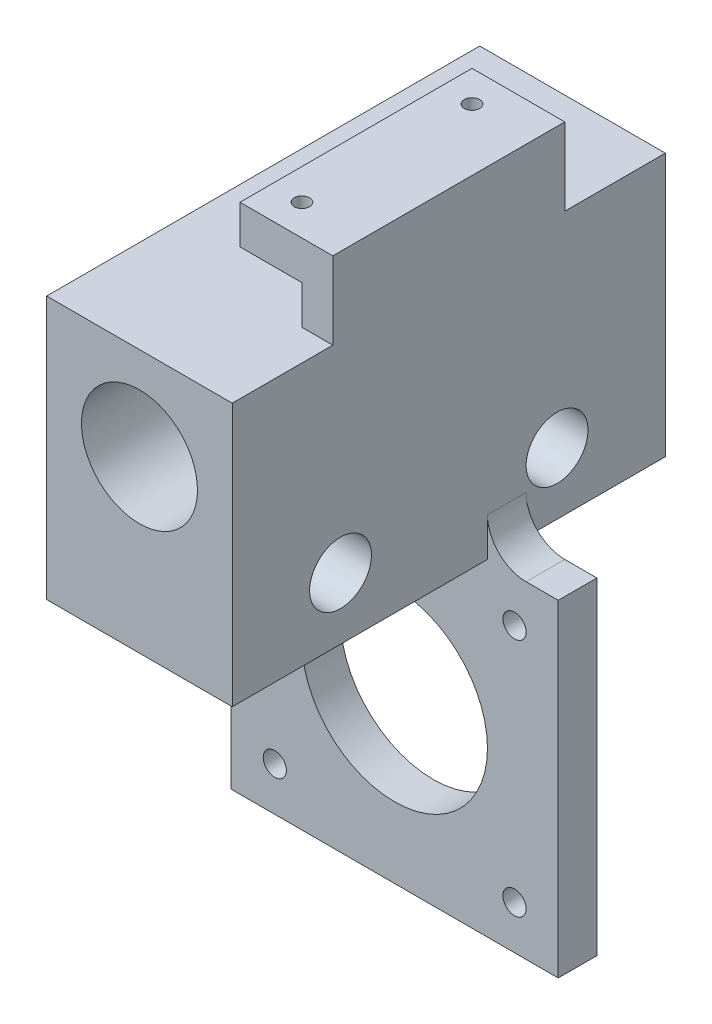
ISO-10303-21;
HEADER;
FILE_DESCRIPTION(('STEP AP214'),'2;1');
FILE_NAME('part.step','',(''),(''),'','','');
FILE_SCHEMA(('AUTOMOTIVE_DESIGN { 1 0 10303 214 1 1 1 1 }'));
ENDSEC;
DATA;
#1=APPLICATION_CONTEXT('core data for automotive mechanical design processes');
#2=APPLICATION_PROTOCOL_DEFINITION('international standard','automotive_design',2000,#1);
#3=PRODUCT_CONTEXT('',#1,'mechanical');
#4=PRODUCT('Part','Part','',(#3));
#5=PRODUCT_RELATED_PRODUCT_CATEGORY('part','',(#4));
#6=PRODUCT_DEFINITION_FORMATION('','',#4);
#7=PRODUCT_DEFINITION_CONTEXT('part definition',#1,'design');
#8=PRODUCT_DEFINITION('design','',#6,#7);
#9=PRODUCT_DEFINITION_SHAPE('','',#8);
#10=(LENGTH_UNIT() NAMED_UNIT(*) SI_UNIT(.MILLI.,.METRE.));
#11=(NAMED_UNIT(*) PLANE_ANGLE_UNIT() SI_UNIT($,.RADIAN.));
#12=(NAMED_UNIT(*) SI_UNIT($,.STERADIAN.) SOLID_ANGLE_UNIT());
#13=UNCERTAINTY_MEASURE_WITH_UNIT(LENGTH_MEASURE(1.E-05),#10,'distance_accuracy_value','');
#14=(GEOMETRIC_REPRESENTATION_CONTEXT(3) GLOBAL_UNCERTAINTY_ASSIGNED_CONTEXT((#13)) GLOBAL_UNIT_ASSIGNED_CONTEXT((#10,
#11,#12)) REPRESENTATION_CONTEXT('',''));
#15=CARTESIAN_POINT('',(0.,0.,0.));
#16=DIRECTION('',(0.,0.,1.));
#17=DIRECTION('',(1.,0.,0.));
#18=AXIS2_PLACEMENT_3D('',#15,#16,#17);
#19=CARTESIAN_POINT('',(-12.,-22.,28.));
#20=DIRECTION('',(0.,1.,0.));
#21=DIRECTION('',(0.,0.,1.));
#22=AXIS2_PLACEMENT_3D('',#19,#20,#21);
#23=PLANE('',#22);
#24=DIRECTION('',(-1.,0.,0.));
#25=VECTOR('',#24,1.);
#26=CARTESIAN_POINT('',(-21.15,-22.,-5.));
#27=LINE('',#26,#25);
#28=CARTESIAN_POINT('',(12.,-22.,-5.));
#29=VERTEX_POINT('',#28);
#30=CARTESIAN_POINT('',(-12.,-22.,-5.));
#31=VERTEX_POINT('',#30);
#32=EDGE_CURVE('E330',#29,#31,#27,.T.);
#33=ORIENTED_EDGE('',*,*,#32,.F.);
#34=DIRECTION('',(0.,0.,-1.));
#35=VECTOR('',#34,1.);
#36=CARTESIAN_POINT('',(12.,-22.,28.));
#37=LINE('',#36,#35);
#38=CARTESIAN_POINT('',(12.,-22.,28.));
#39=VERTEX_POINT('',#38);
#40=EDGE_CURVE('E296',#39,#29,#37,.T.);
#41=ORIENTED_EDGE('',*,*,#40,.F.);
#42=DIRECTION('',(1.,0.,0.));
#43=VECTOR('',#42,1.);
#44=CARTESIAN_POINT('',(-12.,-22.,28.));
#45=LINE('',#44,#43);
#46=CARTESIAN_POINT('',(-12.,-22.,28.));
#47=VERTEX_POINT('',#46);
#48=EDGE_CURVE('E272',#47,#39,#45,.T.);
#49=ORIENTED_EDGE('',*,*,#48,.F.);
#50=DIRECTION('',(0.,0.,-1.));
#51=VECTOR('',#50,1.);
#52=CARTESIAN_POINT('',(-12.,-22.,28.));
#53=LINE('',#52,#51);
#54=EDGE_CURVE('E299',#47,#31,#53,.T.);
#55=ORIENTED_EDGE('',*,*,#54,.T.);
#56=EDGE_LOOP('',(#33,#41,#49,#55));
#57=FACE_BOUND('',#56,.T.);
#58=ADVANCED_FACE('F34',(#57),#23,.F.);
#59=DIRECTION('',(1.,0.,0.));
#60=VECTOR('',#59,1.);
#61=CARTESIAN_POINT('',(-21.15,-22.,-10.));
#62=LINE('',#61,#60);
#63=CARTESIAN_POINT('',(-12.,-22.,-10.));
#64=VERTEX_POINT('',#63);
#65=CARTESIAN_POINT('',(12.,-22.,-10.));
#66=VERTEX_POINT('',#65);
#67=EDGE_CURVE('E308',#64,#66,#62,.T.);
#68=ORIENTED_EDGE('',*,*,#67,.F.);
#69=CARTESIAN_POINT('',(-12.,-22.,-28.));
#70=VERTEX_POINT('',#69);
#71=EDGE_CURVE('E298',#64,#70,#53,.T.);
#72=ORIENTED_EDGE('',*,*,#71,.T.);
#73=DIRECTION('',(1.,0.,0.));
#74=VECTOR('',#73,1.);
#75=CARTESIAN_POINT('',(-12.,-22.,-28.));
#76=LINE('',#75,#74);
#77=CARTESIAN_POINT('',(12.,-22.,-28.));
#78=VERTEX_POINT('',#77);
#79=EDGE_CURVE('E282',#70,#78,#76,.T.);
#80=ORIENTED_EDGE('',*,*,#79,.T.);
#81=EDGE_CURVE('E295',#66,#78,#37,.T.);
#82=ORIENTED_EDGE('',*,*,#81,.F.);
#83=EDGE_LOOP('',(#68,#72,#80,#82));
#84=FACE_BOUND('',#83,.T.);
#85=ADVANCED_FACE('F434',(#84),#23,.F.);
#86=CARTESIAN_POINT('',(-12.,12.,28.));
#87=DIRECTION('',(0.,-1.,0.));
#88=DIRECTION('',(0.,0.,-1.));
#89=AXIS2_PLACEMENT_3D('',#86,#87,#88);
#90=PLANE('',#89);
#91=DIRECTION('',(-1.,0.,0.));
#92=VECTOR('',#91,1.);
#93=CARTESIAN_POINT('',(-12.,12.,-28.));
#94=LINE('',#93,#92);
#95=CARTESIAN_POINT('',(12.,12.,-28.));
#96=VERTEX_POINT('',#95);
#97=CARTESIAN_POINT('',(-12.,12.,-28.));
#98=VERTEX_POINT('',#97);
#99=EDGE_CURVE('E273',#96,#98,#94,.T.);
#100=ORIENTED_EDGE('',*,*,#99,.T.);
#101=DIRECTION('',(0.,0.,-1.));
#102=VECTOR('',#101,1.);
#103=CARTESIAN_POINT('',(-12.,12.,28.));
#104=LINE('',#103,#102);
#105=CARTESIAN_POINT('',(-12.,12.,28.));
#106=VERTEX_POINT('',#105);
#107=EDGE_CURVE('E279',#106,#98,#104,.T.);
#108=ORIENTED_EDGE('',*,*,#107,.F.);
#109=DIRECTION('',(-1.,0.,0.));
#110=VECTOR('',#109,1.);
#111=CARTESIAN_POINT('',(-12.,12.,28.));
#112=LINE('',#111,#110);
#113=CARTESIAN_POINT('',(12.,12.,28.));
#114=VERTEX_POINT('',#113);
#115=EDGE_CURVE('E277',#114,#106,#112,.T.);
#116=ORIENTED_EDGE('',*,*,#115,.F.);
#117=DIRECTION('',(0.,0.,-1.));
#118=VECTOR('',#117,1.);
#119=CARTESIAN_POINT('',(12.,12.,28.));
#120=LINE('',#119,#118);
#121=CARTESIAN_POINT('',(12.,12.,15.));
#122=VERTEX_POINT('',#121);
#123=EDGE_CURVE('E292',#114,#122,#120,.T.);
#124=ORIENTED_EDGE('',*,*,#123,.T.);
#125=DIRECTION('',(1.,0.,0.));
#126=VECTOR('',#125,1.);
#127=CARTESIAN_POINT('',(0.,12.,15.));
#128=LINE('',#127,#126);
#129=CARTESIAN_POINT('',(8.,12.,15.));
#130=VERTEX_POINT('',#129);
#131=EDGE_CURVE('E233',#130,#122,#128,.T.);
#132=ORIENTED_EDGE('',*,*,#131,.F.);
#133=DIRECTION('',(0.,0.,1.));
#134=VECTOR('',#133,1.);
#135=CARTESIAN_POINT('',(8.,12.,-28.));
#136=LINE('',#135,#134);
#137=CARTESIAN_POINT('',(8.,12.,-15.));
#138=VERTEX_POINT('',#137);
#139=EDGE_CURVE('E229',#138,#130,#136,.T.);
#140=ORIENTED_EDGE('',*,*,#139,.F.);
#141=DIRECTION('',(-1.,0.,0.));
#142=VECTOR('',#141,1.);
#143=CARTESIAN_POINT('',(0.,12.,-15.));
#144=LINE('',#143,#142);
#145=CARTESIAN_POINT('',(12.,12.,-15.));
#146=VERTEX_POINT('',#145);
#147=EDGE_CURVE('E241',#146,#138,#144,.T.);
#148=ORIENTED_EDGE('',*,*,#147,.F.);
#149=EDGE_CURVE('E291',#146,#96,#120,.T.);
#150=ORIENTED_EDGE('',*,*,#149,.T.);
#151=EDGE_LOOP('',(#100,#108,#116,#124,#132,#140,#148,#150));
#152=FACE_BOUND('',#151,.T.);
#153=ADVANCED_FACE('F439',(#152),#90,.F.);
#154=CARTESIAN_POINT('',(0.,0.,28.));
#155=DIRECTION('',(0.,0.,1.));
#156=DIRECTION('',(1.,0.,0.));
#157=AXIS2_PLACEMENT_3D('',#154,#155,#156);
#158=PLANE('',#157);
#159=DIRECTION('',(0.,-1.,0.));
#160=VECTOR('',#159,1.);
#161=CARTESIAN_POINT('',(-12.,12.,28.));
#162=LINE('',#161,#160);
#163=EDGE_CURVE('E269',#106,#47,#162,.T.);
#164=ORIENTED_EDGE('',*,*,#163,.T.);
#165=ORIENTED_EDGE('',*,*,#48,.T.);
#166=DIRECTION('',(0.,1.,0.));
#167=VECTOR('',#166,1.);
#168=CARTESIAN_POINT('',(12.,12.,28.));
#169=LINE('',#168,#167);
#170=EDGE_CURVE('E275',#39,#114,#169,.T.);
#171=ORIENTED_EDGE('',*,*,#170,.T.);
#172=ORIENTED_EDGE('',*,*,#115,.T.);
#173=EDGE_LOOP('',(#164,#165,#171,#172));
#174=FACE_BOUND('',#173,.T.);
#175=CARTESIAN_POINT('',(0.,0.,28.));
#176=DIRECTION('',(0.,0.,1.));
#177=DIRECTION('',(1.,0.,0.));
#178=AXIS2_PLACEMENT_3D('',#175,#176,#177);
#179=CIRCLE('',#178,7.5);
#180=CARTESIAN_POINT('',(7.5,0.,28.));
#181=VERTEX_POINT('',#180);
#182=EDGE_CURVE('E263',#181,#181,#179,.T.);
#183=ORIENTED_EDGE('',*,*,#182,.F.);
#184=EDGE_LOOP('',(#183));
#185=FACE_BOUND('',#184,.T.);
#186=ADVANCED_FACE('F477',(#174,#185),#158,.T.);
#187=CARTESIAN_POINT('',(0.,0.,-28.));
#188=DIRECTION('',(0.,0.,1.));
#189=DIRECTION('',(1.,0.,0.));
#190=AXIS2_PLACEMENT_3D('',#187,#188,#189);
#191=PLANE('',#190);
#192=DIRECTION('',(0.,-1.,0.));
#193=VECTOR('',#192,1.);
#194=CARTESIAN_POINT('',(-12.,12.,-28.));
#195=LINE('',#194,#193);
#196=EDGE_CURVE('E266',#98,#70,#195,.T.);
#197=ORIENTED_EDGE('',*,*,#196,.F.);
#198=ORIENTED_EDGE('',*,*,#99,.F.);
#199=DIRECTION('',(0.,1.,0.));
#200=VECTOR('',#199,1.);
#201=CARTESIAN_POINT('',(12.,12.,-28.));
#202=LINE('',#201,#200);
#203=EDGE_CURVE('E285',#78,#96,#202,.T.);
#204=ORIENTED_EDGE('',*,*,#203,.F.);
#205=ORIENTED_EDGE('',*,*,#79,.F.);
#206=EDGE_LOOP('',(#197,#198,#204,#205));
#207=FACE_BOUND('',#206,.T.);
#208=CARTESIAN_POINT('',(0.,0.,-28.));
#209=DIRECTION('',(0.,0.,1.));
#210=DIRECTION('',(1.,0.,0.));
#211=AXIS2_PLACEMENT_3D('',#208,#209,#210);
#212=CIRCLE('',#211,7.5);
#213=CARTESIAN_POINT('',(7.5,0.,-28.));
#214=VERTEX_POINT('',#213);
#215=EDGE_CURVE('E262',#214,#214,#212,.T.);
#216=ORIENTED_EDGE('',*,*,#215,.T.);
#217=EDGE_LOOP('',(#216));
#218=FACE_BOUND('',#217,.T.);
#219=ADVANCED_FACE('F446',(#207,#218),#191,.F.);
#220=CARTESIAN_POINT('',(-12.,12.,28.));
#221=DIRECTION('',(1.,0.,0.));
#222=DIRECTION('',(0.,1.,0.));
#223=AXIS2_PLACEMENT_3D('',#220,#221,#222);
#224=PLANE('',#223);
#225=ORIENTED_EDGE('',*,*,#71,.F.);
#226=DIRECTION('',(0.,1.,0.));
#227=VECTOR('',#226,1.);
#228=CARTESIAN_POINT('',(-12.,-64.3,-10.));
#229=LINE('',#228,#227);
#230=CARTESIAN_POINT('',(-12.,-17.,-10.));
#231=VERTEX_POINT('',#230);
#232=EDGE_CURVE('E335',#64,#231,#229,.T.);
#233=ORIENTED_EDGE('',*,*,#232,.T.);
#234=DIRECTION('',(0.,0.,-1.));
#235=VECTOR('',#234,1.);
#236=CARTESIAN_POINT('',(-12.,-17.,-5.));
#237=LINE('',#236,#235);
#238=CARTESIAN_POINT('',(-12.,-17.,-5.));
#239=VERTEX_POINT('',#238);
#240=EDGE_CURVE('E332',#231,#239,#237,.F.);
#241=ORIENTED_EDGE('',*,*,#240,.T.);
#242=DIRECTION('',(0.,-1.,0.));
#243=VECTOR('',#242,1.);
#244=CARTESIAN_POINT('',(-12.,-64.3,-5.));
#245=LINE('',#244,#243);
#246=EDGE_CURVE('E329',#239,#31,#245,.T.);
#247=ORIENTED_EDGE('',*,*,#246,.T.);
#248=ORIENTED_EDGE('',*,*,#54,.F.);
#249=ORIENTED_EDGE('',*,*,#163,.F.);
#250=ORIENTED_EDGE('',*,*,#107,.T.);
#251=ORIENTED_EDGE('',*,*,#196,.T.);
#252=EDGE_LOOP('',(#225,#233,#241,#247,#248,#249,#250,#251));
#253=FACE_BOUND('',#252,.T.);
#254=ADVANCED_FACE('F444',(#253),#224,.F.);
#255=CARTESIAN_POINT('',(12.,12.,28.));
#256=DIRECTION('',(-1.,0.,0.));
#257=DIRECTION('',(0.,-1.,0.));
#258=AXIS2_PLACEMENT_3D('',#255,#256,#257);
#259=PLANE('',#258);
#260=CARTESIAN_POINT('',(12.,-14.,-14.));
#261=DIRECTION('',(1.,0.,0.));
#262=DIRECTION('',(0.,1.,0.));
#263=AXIS2_PLACEMENT_3D('',#260,#261,#262);
#264=CIRCLE('',#263,4.);
#265=CARTESIAN_POINT('',(12.,-10.,-14.));
#266=VERTEX_POINT('',#265);
#267=EDGE_CURVE('E195',#266,#266,#264,.T.);
#268=ORIENTED_EDGE('',*,*,#267,.F.);
#269=EDGE_LOOP('',(#268));
#270=FACE_BOUND('',#269,.T.);
#271=CARTESIAN_POINT('',(12.,-14.,14.));
#272=DIRECTION('',(1.,0.,0.));
#273=DIRECTION('',(0.,1.,0.));
#274=AXIS2_PLACEMENT_3D('',#271,#272,#273);
#275=CIRCLE('',#274,4.);
#276=CARTESIAN_POINT('',(12.,-10.,14.));
#277=VERTEX_POINT('',#276);
#278=EDGE_CURVE('E205',#277,#277,#275,.T.);
#279=ORIENTED_EDGE('',*,*,#278,.F.);
#280=EDGE_LOOP('',(#279));
#281=FACE_BOUND('',#280,.T.);
#282=DIRECTION('',(0.,0.,-1.));
#283=VECTOR('',#282,1.);
#284=CARTESIAN_POINT('',(12.,-17.,-10.));
#285=LINE('',#284,#283);
#286=CARTESIAN_POINT('',(12.,-17.,-5.));
#287=VERTEX_POINT('',#286);
#288=CARTESIAN_POINT('',(12.,-17.,-10.));
#289=VERTEX_POINT('',#288);
#290=EDGE_CURVE('E343',#287,#289,#285,.T.);
#291=ORIENTED_EDGE('',*,*,#290,.T.);
#292=DIRECTION('',(0.,-1.,0.));
#293=VECTOR('',#292,1.);
#294=CARTESIAN_POINT('',(12.,-64.3,-10.));
#295=LINE('',#294,#293);
#296=EDGE_CURVE('E346',#289,#66,#295,.T.);
#297=ORIENTED_EDGE('',*,*,#296,.T.);
#298=ORIENTED_EDGE('',*,*,#81,.T.);
#299=ORIENTED_EDGE('',*,*,#203,.T.);
#300=ORIENTED_EDGE('',*,*,#149,.F.);
#301=DIRECTION('',(0.,-1.,0.));
#302=VECTOR('',#301,1.);
#303=CARTESIAN_POINT('',(12.,22.,-15.));
#304=LINE('',#303,#302);
#305=CARTESIAN_POINT('',(12.,22.,-15.));
#306=VERTEX_POINT('',#305);
#307=EDGE_CURVE('E253',#306,#146,#304,.T.);
#308=ORIENTED_EDGE('',*,*,#307,.F.);
#309=DIRECTION('',(0.,0.,-1.));
#310=VECTOR('',#309,1.);
#311=CARTESIAN_POINT('',(12.,22.,-15.));
#312=LINE('',#311,#310);
#313=CARTESIAN_POINT('',(12.,22.,15.));
#314=VERTEX_POINT('',#313);
#315=EDGE_CURVE('E243',#314,#306,#312,.T.);
#316=ORIENTED_EDGE('',*,*,#315,.F.);
#317=DIRECTION('',(0.,-1.,0.));
#318=VECTOR('',#317,1.);
#319=CARTESIAN_POINT('',(12.,22.,15.));
#320=LINE('',#319,#318);
#321=EDGE_CURVE('E256',#314,#122,#320,.T.);
#322=ORIENTED_EDGE('',*,*,#321,.T.);
#323=ORIENTED_EDGE('',*,*,#123,.F.);
#324=ORIENTED_EDGE('',*,*,#170,.F.);
#325=ORIENTED_EDGE('',*,*,#40,.T.);
#326=DIRECTION('',(0.,1.,0.));
#327=VECTOR('',#326,1.);
#328=CARTESIAN_POINT('',(12.,-64.3,-5.));
#329=LINE('',#328,#327);
#330=EDGE_CURVE('E48',#29,#287,#329,.T.);
#331=ORIENTED_EDGE('',*,*,#330,.T.);
#332=EDGE_LOOP('',(#291,#297,#298,#299,#300,#308,#316,#322,#323,#324,#325,#331));
#333=FACE_BOUND('',#332,.T.);
#334=ADVANCED_FACE('F365',(#270,#281,#333),#259,.F.);
#335=CARTESIAN_POINT('',(0.,0.,28.));
#336=DIRECTION('',(0.,0.,-1.));
#337=DIRECTION('',(-1.,0.,0.));
#338=AXIS2_PLACEMENT_3D('',#335,#336,#337);
#339=CYLINDRICAL_SURFACE('',#338,7.5);
#340=ORIENTED_EDGE('',*,*,#182,.T.);
#341=EDGE_LOOP('',(#340));
#342=FACE_BOUND('',#341,.T.);
#343=ORIENTED_EDGE('',*,*,#215,.F.);
#344=EDGE_LOOP('',(#343));
#345=FACE_BOUND('',#344,.T.);
#346=ADVANCED_FACE('F524',(#342,#345),#339,.F.);
#347=CARTESIAN_POINT('',(0.,22.,-15.));
#348=DIRECTION('',(1.,0.,0.));
#349=DIRECTION('',(0.,0.,-1.));
#350=AXIS2_PLACEMENT_3D('',#347,#348,#349);
#351=PLANE('',#350);
#352=DIRECTION('',(0.,-1.,0.));
#353=VECTOR('',#352,1.);
#354=CARTESIAN_POINT('',(0.,22.,-15.));
#355=LINE('',#354,#353);
#356=CARTESIAN_POINT('',(0.,22.,-15.));
#357=VERTEX_POINT('',#356);
#358=CARTESIAN_POINT('',(0.,17.,-15.));
#359=VERTEX_POINT('',#358);
#360=EDGE_CURVE('E247',#357,#359,#355,.T.);
#361=ORIENTED_EDGE('',*,*,#360,.T.);
#362=DIRECTION('',(0.,0.,1.));
#363=VECTOR('',#362,1.);
#364=CARTESIAN_POINT('',(0.,17.,-28.));
#365=LINE('',#364,#363);
#366=CARTESIAN_POINT('',(0.,17.,15.));
#367=VERTEX_POINT('',#366);
#368=EDGE_CURVE('E230',#359,#367,#365,.T.);
#369=ORIENTED_EDGE('',*,*,#368,.T.);
#370=DIRECTION('',(0.,-1.,0.));
#371=VECTOR('',#370,1.);
#372=CARTESIAN_POINT('',(0.,22.,15.));
#373=LINE('',#372,#371);
#374=CARTESIAN_POINT('',(0.,22.,15.));
#375=VERTEX_POINT('',#374);
#376=EDGE_CURVE('E259',#375,#367,#373,.T.);
#377=ORIENTED_EDGE('',*,*,#376,.F.);
#378=DIRECTION('',(0.,0.,1.));
#379=VECTOR('',#378,1.);
#380=CARTESIAN_POINT('',(0.,22.,-15.));
#381=LINE('',#380,#379);
#382=EDGE_CURVE('E237',#357,#375,#381,.T.);
#383=ORIENTED_EDGE('',*,*,#382,.F.);
#384=EDGE_LOOP('',(#361,#369,#377,#383));
#385=FACE_BOUND('',#384,.T.);
#386=ADVANCED_FACE('F499',(#385),#351,.F.);
#387=CARTESIAN_POINT('',(0.,22.,15.));
#388=DIRECTION('',(0.,0.,-1.));
#389=DIRECTION('',(-1.,0.,0.));
#390=AXIS2_PLACEMENT_3D('',#387,#388,#389);
#391=PLANE('',#390);
#392=ORIENTED_EDGE('',*,*,#376,.T.);
#393=DIRECTION('',(-1.,0.,0.));
#394=VECTOR('',#393,1.);
#395=CARTESIAN_POINT('',(0.,17.,15.));
#396=LINE('',#395,#394);
#397=CARTESIAN_POINT('',(8.,17.,15.));
#398=VERTEX_POINT('',#397);
#399=EDGE_CURVE('E227',#398,#367,#396,.T.);
#400=ORIENTED_EDGE('',*,*,#399,.F.);
#401=DIRECTION('',(0.,1.,0.));
#402=VECTOR('',#401,1.);
#403=CARTESIAN_POINT('',(8.,17.,15.));
#404=LINE('',#403,#402);
#405=EDGE_CURVE('E224',#130,#398,#404,.T.);
#406=ORIENTED_EDGE('',*,*,#405,.F.);
#407=ORIENTED_EDGE('',*,*,#131,.T.);
#408=ORIENTED_EDGE('',*,*,#321,.F.);
#409=DIRECTION('',(1.,0.,0.));
#410=VECTOR('',#409,1.);
#411=CARTESIAN_POINT('',(0.,22.,15.));
#412=LINE('',#411,#410);
#413=EDGE_CURVE('E240',#375,#314,#412,.T.);
#414=ORIENTED_EDGE('',*,*,#413,.F.);
#415=EDGE_LOOP('',(#392,#400,#406,#407,#408,#414));
#416=FACE_BOUND('',#415,.T.);
#417=ADVANCED_FACE('F483',(#416),#391,.F.);
#418=CARTESIAN_POINT('',(0.,22.,-15.));
#419=DIRECTION('',(0.,0.,1.));
#420=DIRECTION('',(1.,0.,0.));
#421=AXIS2_PLACEMENT_3D('',#418,#419,#420);
#422=PLANE('',#421);
#423=DIRECTION('',(0.,1.,0.));
#424=VECTOR('',#423,1.);
#425=CARTESIAN_POINT('',(8.,22.,-15.));
#426=LINE('',#425,#424);
#427=CARTESIAN_POINT('',(8.,17.,-15.));
#428=VERTEX_POINT('',#427);
#429=EDGE_CURVE('E302',#138,#428,#426,.T.);
#430=ORIENTED_EDGE('',*,*,#429,.T.);
#431=DIRECTION('',(-1.,0.,0.));
#432=VECTOR('',#431,1.);
#433=CARTESIAN_POINT('',(0.,17.,-15.));
#434=LINE('',#433,#432);
#435=EDGE_CURVE('E305',#428,#359,#434,.T.);
#436=ORIENTED_EDGE('',*,*,#435,.T.);
#437=ORIENTED_EDGE('',*,*,#360,.F.);
#438=DIRECTION('',(-1.,0.,0.));
#439=VECTOR('',#438,1.);
#440=CARTESIAN_POINT('',(0.,22.,-15.));
#441=LINE('',#440,#439);
#442=EDGE_CURVE('E245',#306,#357,#441,.T.);
#443=ORIENTED_EDGE('',*,*,#442,.F.);
#444=ORIENTED_EDGE('',*,*,#307,.T.);
#445=ORIENTED_EDGE('',*,*,#147,.T.);
#446=EDGE_LOOP('',(#430,#436,#437,#443,#444,#445));
#447=FACE_BOUND('',#446,.T.);
#448=ADVANCED_FACE('F491',(#447),#422,.F.);
#449=CARTESIAN_POINT('',(0.,22.,0.));
#450=DIRECTION('',(0.,1.,0.));
#451=DIRECTION('',(0.,0.,1.));
#452=AXIS2_PLACEMENT_3D('',#449,#450,#451);
#453=PLANE('',#452);
#454=CARTESIAN_POINT('',(4.,22.,11.));
#455=DIRECTION('',(0.,1.,0.));
#456=DIRECTION('',(0.,0.,1.));
#457=AXIS2_PLACEMENT_3D('',#454,#455,#456);
#458=CIRCLE('',#457,1.);
#459=CARTESIAN_POINT('',(4.,22.,12.));
#460=VERTEX_POINT('',#459);
#461=EDGE_CURVE('E215',#460,#460,#458,.T.);
#462=ORIENTED_EDGE('',*,*,#461,.F.);
#463=EDGE_LOOP('',(#462));
#464=FACE_BOUND('',#463,.T.);
#465=CARTESIAN_POINT('',(4.,22.,-11.));
#466=DIRECTION('',(0.,1.,0.));
#467=DIRECTION('',(0.,0.,1.));
#468=AXIS2_PLACEMENT_3D('',#465,#466,#467);
#469=CIRCLE('',#468,1.);
#470=CARTESIAN_POINT('',(4.,22.,-10.));
#471=VERTEX_POINT('',#470);
#472=EDGE_CURVE('E221',#471,#471,#469,.T.);
#473=ORIENTED_EDGE('',*,*,#472,.F.);
#474=EDGE_LOOP('',(#473));
#475=FACE_BOUND('',#474,.T.);
#476=ORIENTED_EDGE('',*,*,#382,.T.);
#477=ORIENTED_EDGE('',*,*,#413,.T.);
#478=ORIENTED_EDGE('',*,*,#315,.T.);
#479=ORIENTED_EDGE('',*,*,#442,.T.);
#480=EDGE_LOOP('',(#476,#477,#478,#479));
#481=FACE_BOUND('',#480,.T.);
#482=ADVANCED_FACE('F496',(#464,#475,#481),#453,.T.);
#483=CARTESIAN_POINT('',(0.,17.,-28.));
#484=DIRECTION('',(0.,1.,0.));
#485=DIRECTION('',(0.,0.,1.));
#486=AXIS2_PLACEMENT_3D('',#483,#484,#485);
#487=PLANE('',#486);
#488=CARTESIAN_POINT('',(4.,17.,11.));
#489=DIRECTION('',(0.,1.,0.));
#490=DIRECTION('',(0.,0.,1.));
#491=AXIS2_PLACEMENT_3D('',#488,#489,#490);
#492=CIRCLE('',#491,1.);
#493=CARTESIAN_POINT('',(4.,17.,12.));
#494=VERTEX_POINT('',#493);
#495=EDGE_CURVE('E210',#494,#494,#492,.F.);
#496=ORIENTED_EDGE('',*,*,#495,.F.);
#497=EDGE_LOOP('',(#496));
#498=FACE_BOUND('',#497,.T.);
#499=CARTESIAN_POINT('',(4.,17.,-11.));
#500=DIRECTION('',(0.,1.,0.));
#501=DIRECTION('',(0.,0.,1.));
#502=AXIS2_PLACEMENT_3D('',#499,#500,#501);
#503=CIRCLE('',#502,1.);
#504=CARTESIAN_POINT('',(4.,17.,-10.));
#505=VERTEX_POINT('',#504);
#506=EDGE_CURVE('E218',#505,#505,#503,.F.);
#507=ORIENTED_EDGE('',*,*,#506,.F.);
#508=EDGE_LOOP('',(#507));
#509=FACE_BOUND('',#508,.T.);
#510=DIRECTION('',(0.,0.,1.));
#511=VECTOR('',#510,1.);
#512=CARTESIAN_POINT('',(8.,17.,-28.));
#513=LINE('',#512,#511);
#514=EDGE_CURVE('E234',#428,#398,#513,.T.);
#515=ORIENTED_EDGE('',*,*,#514,.T.);
#516=ORIENTED_EDGE('',*,*,#399,.T.);
#517=ORIENTED_EDGE('',*,*,#368,.F.);
#518=ORIENTED_EDGE('',*,*,#435,.F.);
#519=EDGE_LOOP('',(#515,#516,#517,#518));
#520=FACE_BOUND('',#519,.T.);
#521=ADVANCED_FACE('F501',(#498,#509,#520),#487,.F.);
#522=CARTESIAN_POINT('',(8.,17.,-28.));
#523=DIRECTION('',(1.,0.,0.));
#524=DIRECTION('',(0.,0.,-1.));
#525=AXIS2_PLACEMENT_3D('',#522,#523,#524);
#526=PLANE('',#525);
#527=ORIENTED_EDGE('',*,*,#139,.T.);
#528=ORIENTED_EDGE('',*,*,#405,.T.);
#529=ORIENTED_EDGE('',*,*,#514,.F.);
#530=ORIENTED_EDGE('',*,*,#429,.F.);
#531=EDGE_LOOP('',(#527,#528,#529,#530));
#532=FACE_BOUND('',#531,.T.);
#533=ADVANCED_FACE('F488',(#532),#526,.F.);
#534=CARTESIAN_POINT('',(4.,-22.001,-11.));
#535=DIRECTION('',(0.,1.,0.));
#536=DIRECTION('',(0.,0.,1.));
#537=AXIS2_PLACEMENT_3D('',#534,#535,#536);
#538=CYLINDRICAL_SURFACE('',#537,1.);
#539=ORIENTED_EDGE('',*,*,#472,.T.);
#540=EDGE_LOOP('',(#539));
#541=FACE_BOUND('',#540,.T.);
#542=ORIENTED_EDGE('',*,*,#506,.T.);
#543=EDGE_LOOP('',(#542));
#544=FACE_BOUND('',#543,.T.);
#545=ADVANCED_FACE('F509',(#541,#544),#538,.F.);
#546=CARTESIAN_POINT('',(4.,-22.001,11.));
#547=DIRECTION('',(0.,1.,0.));
#548=DIRECTION('',(0.,0.,1.));
#549=AXIS2_PLACEMENT_3D('',#546,#547,#548);
#550=CYLINDRICAL_SURFACE('',#549,1.);
#551=ORIENTED_EDGE('',*,*,#461,.T.);
#552=EDGE_LOOP('',(#551));
#553=FACE_BOUND('',#552,.T.);
#554=ORIENTED_EDGE('',*,*,#495,.T.);
#555=EDGE_LOOP('',(#554));
#556=FACE_BOUND('',#555,.T.);
#557=ADVANCED_FACE('F593',(#553,#556),#550,.F.);
#558=CARTESIAN_POINT('',(-8.,-14.,14.));
#559=DIRECTION('',(1.,0.,0.));
#560=DIRECTION('',(0.,1.,0.));
#561=AXIS2_PLACEMENT_3D('',#558,#559,#560);
#562=CYLINDRICAL_SURFACE('',#561,4.);
#563=CARTESIAN_POINT('',(-8.,-14.,14.));
#564=DIRECTION('',(1.,0.,0.));
#565=DIRECTION('',(0.,1.,0.));
#566=AXIS2_PLACEMENT_3D('',#563,#564,#565);
#567=CIRCLE('',#566,4.);
#568=CARTESIAN_POINT('',(-8.,-10.,14.));
#569=VERTEX_POINT('',#568);
#570=EDGE_CURVE('E207',#569,#569,#567,.T.);
#571=ORIENTED_EDGE('',*,*,#570,.F.);
#572=EDGE_LOOP('',(#571));
#573=FACE_BOUND('',#572,.T.);
#574=ORIENTED_EDGE('',*,*,#278,.T.);
#575=EDGE_LOOP('',(#574));
#576=FACE_BOUND('',#575,.T.);
#577=ADVANCED_FACE('F602',(#573,#576),#562,.F.);
#578=CARTESIAN_POINT('',(-8.,-14.,14.));
#579=DIRECTION('',(1.,0.,0.));
#580=DIRECTION('',(0.,1.,0.));
#581=AXIS2_PLACEMENT_3D('',#578,#579,#580);
#582=PLANE('',#581);
#583=ORIENTED_EDGE('',*,*,#570,.T.);
#584=EDGE_LOOP('',(#583));
#585=FACE_BOUND('',#584,.T.);
#586=ADVANCED_FACE('F611',(#585),#582,.T.);
#587=CARTESIAN_POINT('',(-8.,-14.,-14.));
#588=DIRECTION('',(1.,0.,0.));
#589=DIRECTION('',(0.,1.,0.));
#590=AXIS2_PLACEMENT_3D('',#587,#588,#589);
#591=CYLINDRICAL_SURFACE('',#590,4.);
#592=CARTESIAN_POINT('',(-8.,-14.,-14.));
#593=DIRECTION('',(1.,0.,0.));
#594=DIRECTION('',(0.,1.,0.));
#595=AXIS2_PLACEMENT_3D('',#592,#593,#594);
#596=CIRCLE('',#595,4.);
#597=CARTESIAN_POINT('',(-8.,-10.,-14.));
#598=VERTEX_POINT('',#597);
#599=EDGE_CURVE('E198',#598,#598,#596,.T.);
#600=ORIENTED_EDGE('',*,*,#599,.F.);
#601=EDGE_LOOP('',(#600));
#602=FACE_BOUND('',#601,.T.);
#603=ORIENTED_EDGE('',*,*,#267,.T.);
#604=EDGE_LOOP('',(#603));
#605=FACE_BOUND('',#604,.T.);
#606=ADVANCED_FACE('F621',(#602,#605),#591,.F.);
#607=CARTESIAN_POINT('',(-8.,-14.,-14.));
#608=DIRECTION('',(1.,0.,0.));
#609=DIRECTION('',(0.,1.,0.));
#610=AXIS2_PLACEMENT_3D('',#607,#608,#609);
#611=PLANE('',#610);
#612=ORIENTED_EDGE('',*,*,#599,.T.);
#613=EDGE_LOOP('',(#612));
#614=FACE_BOUND('',#613,.T.);
#615=ADVANCED_FACE('F631',(#614),#611,.T.);
#616=CARTESIAN_POINT('',(0.,-22.,0.));
#617=DIRECTION('',(0.,-1.,0.));
#618=DIRECTION('',(0.,0.,-1.));
#619=AXIS2_PLACEMENT_3D('',#616,#617,#618);
#620=PLANE('',#619);
#621=CARTESIAN_POINT('',(-17.,-22.,-5.));
#622=VERTEX_POINT('',#621);
#623=CARTESIAN_POINT('',(-21.15,-22.,-5.));
#624=VERTEX_POINT('',#623);
#625=EDGE_CURVE('E361',#622,#624,#27,.T.);
#626=ORIENTED_EDGE('',*,*,#625,.F.);
#627=DIRECTION('',(0.,0.,-1.));
#628=VECTOR('',#627,1.);
#629=CARTESIAN_POINT('',(-17.,-22.,-10.));
#630=LINE('',#629,#628);
#631=CARTESIAN_POINT('',(-17.,-22.,-10.));
#632=VERTEX_POINT('',#631);
#633=EDGE_CURVE('E326',#622,#632,#630,.T.);
#634=ORIENTED_EDGE('',*,*,#633,.T.);
#635=CARTESIAN_POINT('',(-21.15,-22.,-10.));
#636=VERTEX_POINT('',#635);
#637=EDGE_CURVE('E375',#636,#632,#62,.T.);
#638=ORIENTED_EDGE('',*,*,#637,.F.);
#639=DIRECTION('',(0.,0.,-1.));
#640=VECTOR('',#639,1.);
#641=CARTESIAN_POINT('',(-21.15,-22.,-5.));
#642=LINE('',#641,#640);
#643=EDGE_CURVE('E194',#624,#636,#642,.T.);
#644=ORIENTED_EDGE('',*,*,#643,.F.);
#645=EDGE_LOOP('',(#626,#634,#638,#644));
#646=FACE_BOUND('',#645,.T.);
#647=ADVANCED_FACE('F461',(#646),#620,.F.);
#648=CARTESIAN_POINT('',(-21.15,-64.3,-5.));
#649=DIRECTION('',(1.,0.,0.));
#650=DIRECTION('',(0.,0.,-1.));
#651=AXIS2_PLACEMENT_3D('',#648,#649,#650);
#652=PLANE('',#651);
#653=ORIENTED_EDGE('',*,*,#643,.T.);
#654=DIRECTION('',(0.,1.,0.));
#655=VECTOR('',#654,1.);
#656=CARTESIAN_POINT('',(-21.15,-64.3,-10.));
#657=LINE('',#656,#655);
#658=CARTESIAN_POINT('',(-21.15,-64.3,-10.));
#659=VERTEX_POINT('',#658);
#660=EDGE_CURVE('E174',#659,#636,#657,.T.);
#661=ORIENTED_EDGE('',*,*,#660,.F.);
#662=DIRECTION('',(0.,0.,-1.));
#663=VECTOR('',#662,1.);
#664=CARTESIAN_POINT('',(-21.15,-64.3,-5.));
#665=LINE('',#664,#663);
#666=CARTESIAN_POINT('',(-21.15,-64.3,-5.));
#667=VERTEX_POINT('',#666);
#668=EDGE_CURVE('E181',#667,#659,#665,.T.);
#669=ORIENTED_EDGE('',*,*,#668,.F.);
#670=DIRECTION('',(0.,1.,0.));
#671=VECTOR('',#670,1.);
#672=CARTESIAN_POINT('',(-21.15,-64.3,-5.));
#673=LINE('',#672,#671);
#674=EDGE_CURVE('E384',#667,#624,#673,.T.);
#675=ORIENTED_EDGE('',*,*,#674,.T.);
#676=EDGE_LOOP('',(#653,#661,#669,#675));
#677=FACE_BOUND('',#676,.T.);
#678=ADVANCED_FACE('F192',(#677),#652,.F.);
#679=CARTESIAN_POINT('',(-21.15,-64.3,-10.));
#680=DIRECTION('',(0.,0.,1.));
#681=DIRECTION('',(1.,0.,0.));
#682=AXIS2_PLACEMENT_3D('',#679,#680,#681);
#683=PLANE('',#682);
#684=CARTESIAN_POINT('',(15.5,-27.65,-10.));
#685=DIRECTION('',(0.,0.,-1.));
#686=DIRECTION('',(-1.,0.,0.));
#687=AXIS2_PLACEMENT_3D('',#684,#685,#686);
#688=CIRCLE('',#687,1.5);
#689=CARTESIAN_POINT('',(14.,-27.65,-10.));
#690=VERTEX_POINT('',#689);
#691=EDGE_CURVE('E317',#690,#690,#688,.T.);
#692=ORIENTED_EDGE('',*,*,#691,.F.);
#693=EDGE_LOOP('',(#692));
#694=FACE_BOUND('',#693,.T.);
#695=CARTESIAN_POINT('',(-15.5,-27.65,-10.));
#696=DIRECTION('',(0.,0.,-1.));
#697=DIRECTION('',(-1.,0.,0.));
#698=AXIS2_PLACEMENT_3D('',#695,#696,#697);
#699=CIRCLE('',#698,1.5);
#700=CARTESIAN_POINT('',(-17.,-27.65,-10.));
#701=VERTEX_POINT('',#700);
#702=EDGE_CURVE('E394',#701,#701,#699,.T.);
#703=ORIENTED_EDGE('',*,*,#702,.F.);
#704=EDGE_LOOP('',(#703));
#705=FACE_BOUND('',#704,.T.);
#706=CARTESIAN_POINT('',(-15.5,-58.65,-10.));
#707=DIRECTION('',(0.,0.,-1.));
#708=DIRECTION('',(-1.,0.,0.));
#709=AXIS2_PLACEMENT_3D('',#706,#707,#708);
#710=CIRCLE('',#709,1.5);
#711=CARTESIAN_POINT('',(-17.,-58.65,-10.));
#712=VERTEX_POINT('',#711);
#713=EDGE_CURVE('E391',#712,#712,#710,.T.);
#714=ORIENTED_EDGE('',*,*,#713,.F.);
#715=EDGE_LOOP('',(#714));
#716=FACE_BOUND('',#715,.T.);
#717=CARTESIAN_POINT('',(15.5,-58.65,-10.));
#718=DIRECTION('',(0.,0.,-1.));
#719=DIRECTION('',(-1.,0.,0.));
#720=AXIS2_PLACEMENT_3D('',#717,#718,#719);
#721=CIRCLE('',#720,1.5);
#722=CARTESIAN_POINT('',(14.,-58.65,-10.));
#723=VERTEX_POINT('',#722);
#724=EDGE_CURVE('E388',#723,#723,#721,.T.);
#725=ORIENTED_EDGE('',*,*,#724,.F.);
#726=EDGE_LOOP('',(#725));
#727=FACE_BOUND('',#726,.T.);
#728=CARTESIAN_POINT('',(0.,-43.15,-10.));
#729=DIRECTION('',(0.,0.,-1.));
#730=DIRECTION('',(-1.,0.,0.));
#731=AXIS2_PLACEMENT_3D('',#728,#729,#730);
#732=CIRCLE('',#731,12.);
#733=CARTESIAN_POINT('',(-12.,-43.15,-10.));
#734=VERTEX_POINT('',#733);
#735=EDGE_CURVE('E312',#734,#734,#732,.T.);
#736=ORIENTED_EDGE('',*,*,#735,.F.);
#737=EDGE_LOOP('',(#736));
#738=FACE_BOUND('',#737,.T.);
#739=ORIENTED_EDGE('',*,*,#637,.T.);
#740=CARTESIAN_POINT('',(-17.,-17.,-10.));
#741=DIRECTION('',(0.,0.,1.));
#742=DIRECTION('',(1.,0.,0.));
#743=AXIS2_PLACEMENT_3D('',#740,#741,#742);
#744=CIRCLE('',#743,5.);
#745=EDGE_CURVE('E338',#632,#231,#744,.T.);
#746=ORIENTED_EDGE('',*,*,#745,.T.);
#747=ORIENTED_EDGE('',*,*,#232,.F.);
#748=ORIENTED_EDGE('',*,*,#67,.T.);
#749=ORIENTED_EDGE('',*,*,#296,.F.);
#750=CARTESIAN_POINT('',(17.,-17.,-10.));
#751=DIRECTION('',(0.,0.,1.));
#752=DIRECTION('',(1.,0.,0.));
#753=AXIS2_PLACEMENT_3D('',#750,#751,#752);
#754=CIRCLE('',#753,5.);
#755=CARTESIAN_POINT('',(17.,-22.,-10.));
#756=VERTEX_POINT('',#755);
#757=EDGE_CURVE('E42',#289,#756,#754,.T.);
#758=ORIENTED_EDGE('',*,*,#757,.T.);
#759=CARTESIAN_POINT('',(21.15,-22.,-10.));
#760=VERTEX_POINT('',#759);
#761=EDGE_CURVE('E355',#756,#760,#62,.T.);
#762=ORIENTED_EDGE('',*,*,#761,.T.);
#763=DIRECTION('',(0.,1.,0.));
#764=VECTOR('',#763,1.);
#765=CARTESIAN_POINT('',(21.15,-64.3,-10.));
#766=LINE('',#765,#764);
#767=CARTESIAN_POINT('',(21.15,-64.3,-10.));
#768=VERTEX_POINT('',#767);
#769=EDGE_CURVE('E177',#768,#760,#766,.T.);
#770=ORIENTED_EDGE('',*,*,#769,.F.);
#771=DIRECTION('',(1.,0.,0.));
#772=VECTOR('',#771,1.);
#773=CARTESIAN_POINT('',(-21.15,-64.3,-10.));
#774=LINE('',#773,#772);
#775=EDGE_CURVE('E169',#659,#768,#774,.T.);
#776=ORIENTED_EDGE('',*,*,#775,.F.);
#777=ORIENTED_EDGE('',*,*,#660,.T.);
#778=EDGE_LOOP('',(#739,#746,#747,#748,#749,#758,#762,#770,#776,#777));
#779=FACE_BOUND('',#778,.T.);
#780=ADVANCED_FACE('F172',(#694,#705,#716,#727,#738,#779),#683,.F.);
#781=CARTESIAN_POINT('',(21.15,-64.3,-5.));
#782=DIRECTION('',(-1.,0.,0.));
#783=DIRECTION('',(0.,0.,1.));
#784=AXIS2_PLACEMENT_3D('',#781,#782,#783);
#785=PLANE('',#784);
#786=DIRECTION('',(0.,0.,1.));
#787=VECTOR('',#786,1.);
#788=CARTESIAN_POINT('',(21.15,-22.,-5.));
#789=LINE('',#788,#787);
#790=CARTESIAN_POINT('',(21.15,-22.,-5.));
#791=VERTEX_POINT('',#790);
#792=EDGE_CURVE('E378',#760,#791,#789,.T.);
#793=ORIENTED_EDGE('',*,*,#792,.T.);
#794=DIRECTION('',(0.,1.,0.));
#795=VECTOR('',#794,1.);
#796=CARTESIAN_POINT('',(21.15,-64.3,-5.));
#797=LINE('',#796,#795);
#798=CARTESIAN_POINT('',(21.15,-64.3,-5.));
#799=VERTEX_POINT('',#798);
#800=EDGE_CURVE('E200',#799,#791,#797,.T.);
#801=ORIENTED_EDGE('',*,*,#800,.F.);
#802=DIRECTION('',(0.,0.,1.));
#803=VECTOR('',#802,1.);
#804=CARTESIAN_POINT('',(21.15,-64.3,-5.));
#805=LINE('',#804,#803);
#806=EDGE_CURVE('E180',#768,#799,#805,.T.);
#807=ORIENTED_EDGE('',*,*,#806,.F.);
#808=ORIENTED_EDGE('',*,*,#769,.T.);
#809=EDGE_LOOP('',(#793,#801,#807,#808));
#810=FACE_BOUND('',#809,.T.);
#811=ADVANCED_FACE('F405',(#810),#785,.F.);
#812=CARTESIAN_POINT('',(-21.15,-64.3,-5.));
#813=DIRECTION('',(0.,0.,-1.));
#814=DIRECTION('',(-1.,0.,0.));
#815=AXIS2_PLACEMENT_3D('',#812,#813,#814);
#816=PLANE('',#815);
#817=CARTESIAN_POINT('',(15.5,-27.65,-5.));
#818=DIRECTION('',(0.,0.,-1.));
#819=DIRECTION('',(-1.,0.,0.));
#820=AXIS2_PLACEMENT_3D('',#817,#818,#819);
#821=CIRCLE('',#820,1.5);
#822=CARTESIAN_POINT('',(14.,-27.65,-5.));
#823=VERTEX_POINT('',#822);
#824=EDGE_CURVE('E323',#823,#823,#821,.T.);
#825=ORIENTED_EDGE('',*,*,#824,.T.);
#826=EDGE_LOOP('',(#825));
#827=FACE_BOUND('',#826,.T.);
#828=CARTESIAN_POINT('',(-15.5,-27.65,-5.));
#829=DIRECTION('',(0.,0.,-1.));
#830=DIRECTION('',(-1.,0.,0.));
#831=AXIS2_PLACEMENT_3D('',#828,#829,#830);
#832=CIRCLE('',#831,1.5);
#833=CARTESIAN_POINT('',(-17.,-27.65,-5.));
#834=VERTEX_POINT('',#833);
#835=EDGE_CURVE('E320',#834,#834,#832,.T.);
#836=ORIENTED_EDGE('',*,*,#835,.T.);
#837=EDGE_LOOP('',(#836));
#838=FACE_BOUND('',#837,.T.);
#839=CARTESIAN_POINT('',(-15.5,-58.65,-5.));
#840=DIRECTION('',(0.,0.,-1.));
#841=DIRECTION('',(-1.,0.,0.));
#842=AXIS2_PLACEMENT_3D('',#839,#840,#841);
#843=CIRCLE('',#842,1.5);
#844=CARTESIAN_POINT('',(-17.,-58.65,-5.));
#845=VERTEX_POINT('',#844);
#846=EDGE_CURVE('E316',#845,#845,#843,.T.);
#847=ORIENTED_EDGE('',*,*,#846,.T.);
#848=EDGE_LOOP('',(#847));
#849=FACE_BOUND('',#848,.T.);
#850=CARTESIAN_POINT('',(15.5,-58.65,-5.));
#851=DIRECTION('',(0.,0.,-1.));
#852=DIRECTION('',(-1.,0.,0.));
#853=AXIS2_PLACEMENT_3D('',#850,#851,#852);
#854=CIRCLE('',#853,1.5);
#855=CARTESIAN_POINT('',(14.,-58.65,-5.));
#856=VERTEX_POINT('',#855);
#857=EDGE_CURVE('E313',#856,#856,#854,.T.);
#858=ORIENTED_EDGE('',*,*,#857,.T.);
#859=EDGE_LOOP('',(#858));
#860=FACE_BOUND('',#859,.T.);
#861=CARTESIAN_POINT('',(0.,-43.15,-5.));
#862=DIRECTION('',(0.,0.,-1.));
#863=DIRECTION('',(-1.,0.,0.));
#864=AXIS2_PLACEMENT_3D('',#861,#862,#863);
#865=CIRCLE('',#864,12.);
#866=CARTESIAN_POINT('',(-12.,-43.15,-5.));
#867=VERTEX_POINT('',#866);
#868=EDGE_CURVE('E309',#867,#867,#865,.T.);
#869=ORIENTED_EDGE('',*,*,#868,.T.);
#870=EDGE_LOOP('',(#869));
#871=FACE_BOUND('',#870,.T.);
#872=CARTESIAN_POINT('',(17.,-22.,-5.));
#873=VERTEX_POINT('',#872);
#874=EDGE_CURVE('E190',#791,#873,#27,.T.);
#875=ORIENTED_EDGE('',*,*,#874,.T.);
#876=CARTESIAN_POINT('',(17.,-17.,-5.));
#877=DIRECTION('',(0.,0.,-1.));
#878=DIRECTION('',(-1.,0.,0.));
#879=AXIS2_PLACEMENT_3D('',#876,#877,#878);
#880=CIRCLE('',#879,5.);
#881=EDGE_CURVE('E11',#873,#287,#880,.T.);
#882=ORIENTED_EDGE('',*,*,#881,.T.);
#883=ORIENTED_EDGE('',*,*,#330,.F.);
#884=ORIENTED_EDGE('',*,*,#32,.T.);
#885=ORIENTED_EDGE('',*,*,#246,.F.);
#886=CARTESIAN_POINT('',(-17.,-17.,-5.));
#887=DIRECTION('',(0.,0.,-1.));
#888=DIRECTION('',(-1.,0.,0.));
#889=AXIS2_PLACEMENT_3D('',#886,#887,#888);
#890=CIRCLE('',#889,5.);
#891=EDGE_CURVE('E340',#239,#622,#890,.T.);
#892=ORIENTED_EDGE('',*,*,#891,.T.);
#893=ORIENTED_EDGE('',*,*,#625,.T.);
#894=ORIENTED_EDGE('',*,*,#674,.F.);
#895=DIRECTION('',(-1.,0.,0.));
#896=VECTOR('',#895,1.);
#897=CARTESIAN_POINT('',(-21.15,-64.3,-5.));
#898=LINE('',#897,#896);
#899=EDGE_CURVE('E186',#799,#667,#898,.T.);
#900=ORIENTED_EDGE('',*,*,#899,.F.);
#901=ORIENTED_EDGE('',*,*,#800,.T.);
#902=EDGE_LOOP('',(#875,#882,#883,#884,#885,#892,#893,#894,#900,#901));
#903=FACE_BOUND('',#902,.T.);
#904=ADVANCED_FACE('F359',(#827,#838,#849,#860,#871,#903),#816,.F.);
#905=CARTESIAN_POINT('',(0.,-64.3,0.));
#906=DIRECTION('',(0.,-1.,0.));
#907=DIRECTION('',(0.,0.,-1.));
#908=AXIS2_PLACEMENT_3D('',#905,#906,#907);
#909=PLANE('',#908);
#910=ORIENTED_EDGE('',*,*,#668,.T.);
#911=ORIENTED_EDGE('',*,*,#775,.T.);
#912=ORIENTED_EDGE('',*,*,#806,.T.);
#913=ORIENTED_EDGE('',*,*,#899,.T.);
#914=EDGE_LOOP('',(#910,#911,#912,#913));
#915=FACE_BOUND('',#914,.T.);
#916=ADVANCED_FACE('F184',(#915),#909,.T.);
#917=ORIENTED_EDGE('',*,*,#761,.F.);
#918=DIRECTION('',(0.,0.,-1.));
#919=VECTOR('',#918,1.);
#920=CARTESIAN_POINT('',(17.,-22.,-5.));
#921=LINE('',#920,#919);
#922=EDGE_CURVE('E348',#756,#873,#921,.F.);
#923=ORIENTED_EDGE('',*,*,#922,.T.);
#924=ORIENTED_EDGE('',*,*,#874,.F.);
#925=ORIENTED_EDGE('',*,*,#792,.F.);
#926=EDGE_LOOP('',(#917,#923,#924,#925));
#927=FACE_BOUND('',#926,.T.);
#928=ADVANCED_FACE('F353',(#927),#620,.F.);
#929=CARTESIAN_POINT('',(0.,-43.15,38.));
#930=DIRECTION('',(0.,0.,-1.));
#931=DIRECTION('',(-1.,0.,0.));
#932=AXIS2_PLACEMENT_3D('',#929,#930,#931);
#933=CYLINDRICAL_SURFACE('',#932,12.);
#934=ORIENTED_EDGE('',*,*,#735,.T.);
#935=EDGE_LOOP('',(#934));
#936=FACE_BOUND('',#935,.T.);
#937=ORIENTED_EDGE('',*,*,#868,.F.);
#938=EDGE_LOOP('',(#937));
#939=FACE_BOUND('',#938,.T.);
#940=ADVANCED_FACE('F415',(#936,#939),#933,.F.);
#941=CARTESIAN_POINT('',(15.5,-58.65,38.));
#942=DIRECTION('',(0.,0.,-1.));
#943=DIRECTION('',(-1.,0.,0.));
#944=AXIS2_PLACEMENT_3D('',#941,#942,#943);
#945=CYLINDRICAL_SURFACE('',#944,1.5);
#946=ORIENTED_EDGE('',*,*,#724,.T.);
#947=EDGE_LOOP('',(#946));
#948=FACE_BOUND('',#947,.T.);
#949=ORIENTED_EDGE('',*,*,#857,.F.);
#950=EDGE_LOOP('',(#949));
#951=FACE_BOUND('',#950,.T.);
#952=ADVANCED_FACE('F418',(#948,#951),#945,.F.);
#953=CARTESIAN_POINT('',(-15.5,-58.65,38.));
#954=DIRECTION('',(0.,0.,-1.));
#955=DIRECTION('',(-1.,0.,0.));
#956=AXIS2_PLACEMENT_3D('',#953,#954,#955);
#957=CYLINDRICAL_SURFACE('',#956,1.5);
#958=ORIENTED_EDGE('',*,*,#713,.T.);
#959=EDGE_LOOP('',(#958));
#960=FACE_BOUND('',#959,.T.);
#961=ORIENTED_EDGE('',*,*,#846,.F.);
#962=EDGE_LOOP('',(#961));
#963=FACE_BOUND('',#962,.T.);
#964=ADVANCED_FACE('F690',(#960,#963),#957,.F.);
#965=CARTESIAN_POINT('',(-15.5,-27.65,38.));
#966=DIRECTION('',(0.,0.,-1.));
#967=DIRECTION('',(-1.,0.,0.));
#968=AXIS2_PLACEMENT_3D('',#965,#966,#967);
#969=CYLINDRICAL_SURFACE('',#968,1.5);
#970=ORIENTED_EDGE('',*,*,#702,.T.);
#971=EDGE_LOOP('',(#970));
#972=FACE_BOUND('',#971,.T.);
#973=ORIENTED_EDGE('',*,*,#835,.F.);
#974=EDGE_LOOP('',(#973));
#975=FACE_BOUND('',#974,.T.);
#976=ADVANCED_FACE('F455',(#972,#975),#969,.F.);
#977=CARTESIAN_POINT('',(15.5,-27.65,38.));
#978=DIRECTION('',(0.,0.,-1.));
#979=DIRECTION('',(-1.,0.,0.));
#980=AXIS2_PLACEMENT_3D('',#977,#978,#979);
#981=CYLINDRICAL_SURFACE('',#980,1.5);
#982=ORIENTED_EDGE('',*,*,#691,.T.);
#983=EDGE_LOOP('',(#982));
#984=FACE_BOUND('',#983,.T.);
#985=ORIENTED_EDGE('',*,*,#824,.F.);
#986=EDGE_LOOP('',(#985));
#987=FACE_BOUND('',#986,.T.);
#988=ADVANCED_FACE('F400',(#984,#987),#981,.F.);
#989=CARTESIAN_POINT('',(-17.,-17.,0.));
#990=DIRECTION('',(0.,0.,1.));
#991=DIRECTION('',(1.,0.,0.));
#992=AXIS2_PLACEMENT_3D('',#989,#990,#991);
#993=CYLINDRICAL_SURFACE('',#992,5.);
#994=ORIENTED_EDGE('',*,*,#891,.F.);
#995=ORIENTED_EDGE('',*,*,#240,.F.);
#996=ORIENTED_EDGE('',*,*,#745,.F.);
#997=ORIENTED_EDGE('',*,*,#633,.F.);
#998=EDGE_LOOP('',(#994,#995,#996,#997));
#999=FACE_BOUND('',#998,.T.);
#1000=ADVANCED_FACE('F448',(#999),#993,.F.);
#1001=CARTESIAN_POINT('',(17.,-17.,28.));
#1002=DIRECTION('',(0.,0.,1.));
#1003=DIRECTION('',(1.,0.,0.));
#1004=AXIS2_PLACEMENT_3D('',#1001,#1002,#1003);
#1005=CYLINDRICAL_SURFACE('',#1004,5.);
#1006=ORIENTED_EDGE('',*,*,#881,.F.);
#1007=ORIENTED_EDGE('',*,*,#922,.F.);
#1008=ORIENTED_EDGE('',*,*,#757,.F.);
#1009=ORIENTED_EDGE('',*,*,#290,.F.);
#1010=EDGE_LOOP('',(#1006,#1007,#1008,#1009));
#1011=FACE_BOUND('',#1010,.T.);
#1012=ADVANCED_FACE('F36',(#1011),#1005,.F.);
#1013=CLOSED_SHELL('',(#58,#85,#153,#186,#219,#254,#334,#346,#386,#417,#448,#482,#521,#533,#545,
#557,#577,#586,#606,#615,#647,#678,#780,#811,#904,#916,#928,#940,#952,#964,#976,#988,#1000,#1012));
#1014=MANIFOLD_SOLID_BREP('B2',#1013);
#1015=ADVANCED_BREP_SHAPE_REPRESENTATION('',(#18,#1014),#14);
#1016=SHAPE_DEFINITION_REPRESENTATION(#9,#1015);
ENDSEC;
END-ISO-10303-21;
